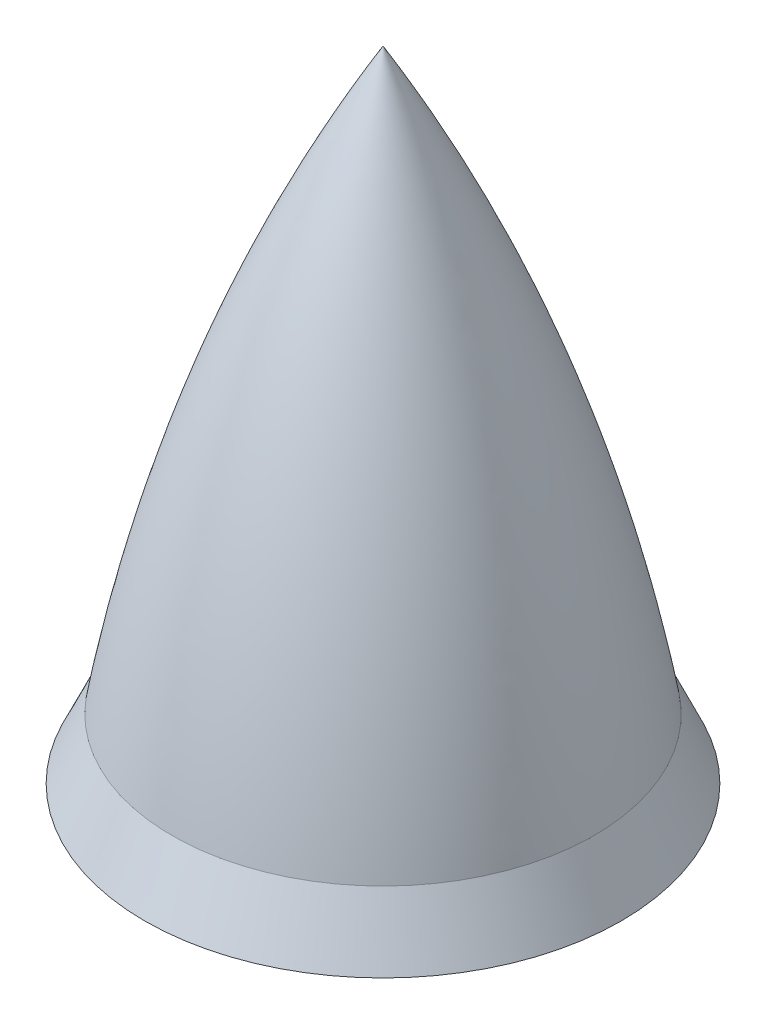
ISO-10303-21;
HEADER;
FILE_DESCRIPTION(('STEP AP214'),'2;1');
FILE_NAME('part.step','',(''),(''),'','','');
FILE_SCHEMA(('AUTOMOTIVE_DESIGN { 1 0 10303 214 1 1 1 1 }'));
ENDSEC;
DATA;
#1=APPLICATION_CONTEXT('core data for automotive mechanical design processes');
#2=APPLICATION_PROTOCOL_DEFINITION('international standard','automotive_design',2000,#1);
#3=PRODUCT_CONTEXT('',#1,'mechanical');
#4=PRODUCT('Part','Part','',(#3));
#5=PRODUCT_RELATED_PRODUCT_CATEGORY('part','',(#4));
#6=PRODUCT_DEFINITION_FORMATION('','',#4);
#7=PRODUCT_DEFINITION_CONTEXT('part definition',#1,'design');
#8=PRODUCT_DEFINITION('design','',#6,#7);
#9=PRODUCT_DEFINITION_SHAPE('','',#8);
#10=(LENGTH_UNIT() NAMED_UNIT(*) SI_UNIT(.MILLI.,.METRE.));
#11=(NAMED_UNIT(*) PLANE_ANGLE_UNIT() SI_UNIT($,.RADIAN.));
#12=(NAMED_UNIT(*) SI_UNIT($,.STERADIAN.) SOLID_ANGLE_UNIT());
#13=UNCERTAINTY_MEASURE_WITH_UNIT(LENGTH_MEASURE(1.E-05),#10,'distance_accuracy_value','');
#14=(GEOMETRIC_REPRESENTATION_CONTEXT(3) GLOBAL_UNCERTAINTY_ASSIGNED_CONTEXT((#13)) GLOBAL_UNIT_ASSIGNED_CONTEXT((#10,
#11,#12)) REPRESENTATION_CONTEXT('',''));
#15=CARTESIAN_POINT('',(0.,0.,0.));
#16=DIRECTION('',(0.,0.,1.));
#17=DIRECTION('',(1.,0.,0.));
#18=AXIS2_PLACEMENT_3D('',#15,#16,#17);
#19=CARTESIAN_POINT('',(0.,0.,0.));
#20=DIRECTION('',(0.,1.,0.));
#21=DIRECTION('',(0.,0.,1.));
#22=AXIS2_PLACEMENT_3D('',#19,#20,#21);
#23=PLANE('',#22);
#24=CARTESIAN_POINT('',(0.,0.,0.));
#25=DIRECTION('',(0.,-1.,0.));
#26=DIRECTION('',(0.,0.,-1.));
#27=AXIS2_PLACEMENT_3D('',#24,#25,#26);
#28=CIRCLE('',#27,2.5);
#29=CARTESIAN_POINT('',(0.,0.,-2.5));
#30=VERTEX_POINT('',#29);
#31=EDGE_CURVE('E71',#30,#30,#28,.T.);
#32=ORIENTED_EDGE('',*,*,#31,.F.);
#33=EDGE_LOOP('',(#32));
#34=FACE_BOUND('',#33,.T.);
#35=CARTESIAN_POINT('',(0.,0.,0.));
#36=DIRECTION('',(0.,-1.,0.));
#37=DIRECTION('',(0.,0.,-1.));
#38=AXIS2_PLACEMENT_3D('',#35,#36,#37);
#39=CIRCLE('',#38,5.93);
#40=CARTESIAN_POINT('',(0.,0.,-5.93));
#41=VERTEX_POINT('',#40);
#42=EDGE_CURVE('E11',#41,#41,#39,.T.);
#43=ORIENTED_EDGE('',*,*,#42,.T.);
#44=EDGE_LOOP('',(#43));
#45=FACE_BOUND('',#44,.T.);
#46=ADVANCED_FACE('F38',(#34,#45),#23,.F.);
#47=CARTESIAN_POINT('',(0.,1.5,0.));
#48=DIRECTION('',(0.,-1.,0.));
#49=DIRECTION('',(0.,0.,-1.));
#50=AXIS2_PLACEMENT_3D('',#47,#48,#49);
#51=CONICAL_SURFACE('',#50,5.25,0.425622468339631);
#52=ORIENTED_EDGE('',*,*,#42,.F.);
#53=EDGE_LOOP('',(#52));
#54=FACE_BOUND('',#53,.T.);
#55=CARTESIAN_POINT('',(0.,1.5,0.));
#56=DIRECTION('',(0.,-1.,0.));
#57=DIRECTION('',(0.,0.,-1.));
#58=AXIS2_PLACEMENT_3D('',#55,#56,#57);
#59=CIRCLE('',#58,5.25);
#60=CARTESIAN_POINT('',(0.,1.5,-5.25));
#61=VERTEX_POINT('',#60);
#62=EDGE_CURVE('E45',#61,#61,#59,.T.);
#63=ORIENTED_EDGE('',*,*,#62,.T.);
#64=EDGE_LOOP('',(#63));
#65=FACE_BOUND('',#64,.T.);
#66=ADVANCED_FACE('F51',(#54,#65),#51,.T.);
#67=CARTESIAN_POINT('',(0.,-5.95730995005328,37.5779072915747));
#68=DIRECTION('',(-1.,0.,0.));
#69=DIRECTION('',(0.,0.,-1.));
#70=AXIS2_PLACEMENT_3D('',#67,#68,#69);
#71=CIRCLE('',#70,43.4723028452241);
#72=TRIMMED_CURVE('',#71,(PARAMETER_VALUE(-0.526819959256561)),
(PARAMETER_VALUE(0.526819959256561)),.T.,.PARAMETER.);
#73=CARTESIAN_POINT('',(0.,-5.95730995005328,0.));
#74=DIRECTION('',(0.,-1.,0.));
#75=AXIS1_PLACEMENT('',#73,#74);
#76=SURFACE_OF_REVOLUTION('',#72,#75);
#77=ORIENTED_EDGE('',*,*,#62,.F.);
#78=EDGE_LOOP('',(#77));
#79=FACE_BOUND('',#78,.T.);
#80=CARTESIAN_POINT('',(0.,15.9,0.));
#81=VERTEX_POINT('',#80);
#82=VERTEX_LOOP('',#81);
#83=FACE_BOUND('',#82,.T.);
#84=ADVANCED_FACE('F48',(#79,#83),#76,.T.);
#85=CARTESIAN_POINT('',(0.,5.,0.));
#86=DIRECTION('',(0.,-1.,0.));
#87=DIRECTION('',(0.,0.,-1.));
#88=AXIS2_PLACEMENT_3D('',#85,#86,#87);
#89=CYLINDRICAL_SURFACE('',#88,2.5);
#90=CARTESIAN_POINT('',(0.,5.,0.));
#91=DIRECTION('',(0.,-1.,0.));
#92=DIRECTION('',(0.,0.,-1.));
#93=AXIS2_PLACEMENT_3D('',#90,#91,#92);
#94=CIRCLE('',#93,2.5);
#95=CARTESIAN_POINT('',(0.,5.,-2.5));
#96=VERTEX_POINT('',#95);
#97=EDGE_CURVE('E76',#96,#96,#94,.T.);
#98=ORIENTED_EDGE('',*,*,#97,.F.);
#99=EDGE_LOOP('',(#98));
#100=FACE_BOUND('',#99,.T.);
#101=ORIENTED_EDGE('',*,*,#31,.T.);
#102=EDGE_LOOP('',(#101));
#103=FACE_BOUND('',#102,.T.);
#104=ADVANCED_FACE('F50',(#100,#103),#89,.F.);
#105=CARTESIAN_POINT('',(0.,5.,0.));
#106=DIRECTION('',(0.,-1.,0.));
#107=DIRECTION('',(0.,0.,-1.));
#108=AXIS2_PLACEMENT_3D('',#105,#106,#107);
#109=PLANE('',#108);
#110=ORIENTED_EDGE('',*,*,#97,.T.);
#111=EDGE_LOOP('',(#110));
#112=FACE_BOUND('',#111,.T.);
#113=ADVANCED_FACE('F58',(#112),#109,.T.);
#114=CLOSED_SHELL('',(#46,#66,#84,#104,#113));
#115=MANIFOLD_SOLID_BREP('B2',#114);
#116=ADVANCED_BREP_SHAPE_REPRESENTATION('',(#18,#115),#14);
#117=SHAPE_DEFINITION_REPRESENTATION(#9,#116);
ENDSEC;
END-ISO-10303-21;
